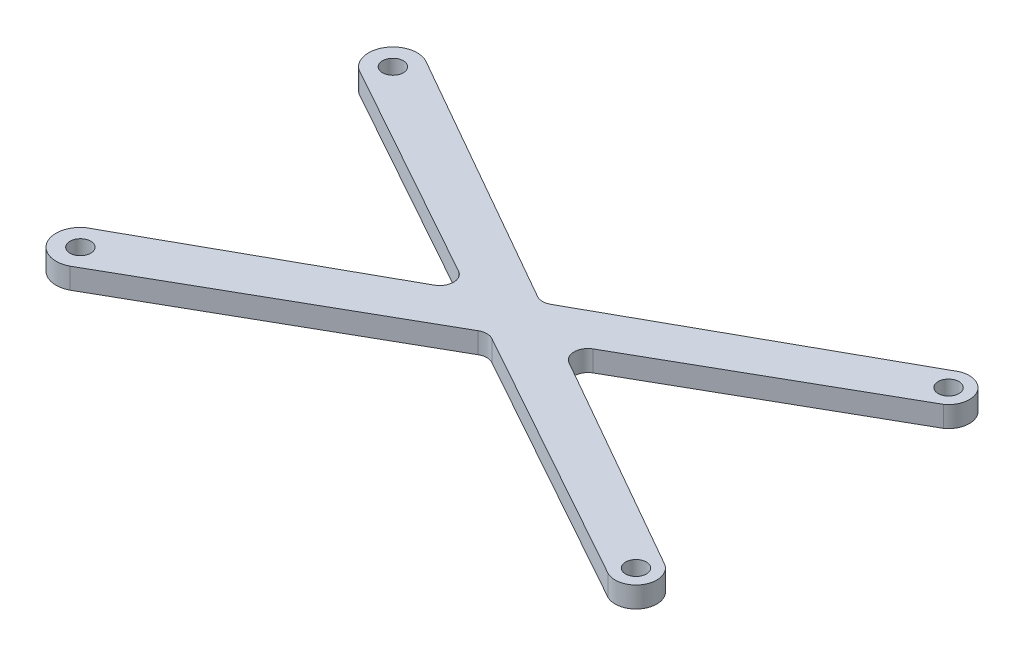
ISO-10303-21;
HEADER;
FILE_DESCRIPTION(('STEP AP214'),'2;1');
FILE_NAME('part.step','',(''),(''),'','','');
FILE_SCHEMA(('AUTOMOTIVE_DESIGN { 1 0 10303 214 1 1 1 1 }'));
ENDSEC;
DATA;
#1=APPLICATION_CONTEXT('core data for automotive mechanical design processes');
#2=APPLICATION_PROTOCOL_DEFINITION('international standard','automotive_design',2000,#1);
#3=PRODUCT_CONTEXT('',#1,'mechanical');
#4=PRODUCT('Part','Part','',(#3));
#5=PRODUCT_RELATED_PRODUCT_CATEGORY('part','',(#4));
#6=PRODUCT_DEFINITION_FORMATION('','',#4);
#7=PRODUCT_DEFINITION_CONTEXT('part definition',#1,'design');
#8=PRODUCT_DEFINITION('design','',#6,#7);
#9=PRODUCT_DEFINITION_SHAPE('','',#8);
#10=(LENGTH_UNIT() NAMED_UNIT(*) SI_UNIT(.MILLI.,.METRE.));
#11=(NAMED_UNIT(*) PLANE_ANGLE_UNIT() SI_UNIT($,.RADIAN.));
#12=(NAMED_UNIT(*) SI_UNIT($,.STERADIAN.) SOLID_ANGLE_UNIT());
#13=UNCERTAINTY_MEASURE_WITH_UNIT(LENGTH_MEASURE(1.E-05),#10,'distance_accuracy_value','');
#14=(GEOMETRIC_REPRESENTATION_CONTEXT(3) GLOBAL_UNCERTAINTY_ASSIGNED_CONTEXT((#13)) GLOBAL_UNIT_ASSIGNED_CONTEXT((#10,
#11,#12)) REPRESENTATION_CONTEXT('',''));
#15=CARTESIAN_POINT('',(0.,0.,0.));
#16=DIRECTION('',(0.,0.,1.));
#17=DIRECTION('',(1.,0.,0.));
#18=AXIS2_PLACEMENT_3D('',#15,#16,#17);
#19=CARTESIAN_POINT('',(0.,3.,-45.));
#20=DIRECTION('',(0.,1.,0.));
#21=DIRECTION('',(0.,0.,1.));
#22=AXIS2_PLACEMENT_3D('',#19,#20,#21);
#23=PLANE('',#22);
#24=CARTESIAN_POINT('',(80.,3.,0.));
#25=DIRECTION('',(0.,1.,0.));
#26=DIRECTION('',(0.,0.,1.));
#27=AXIS2_PLACEMENT_3D('',#24,#25,#26);
#28=CIRCLE('',#27,1.5);
#29=CARTESIAN_POINT('',(80.,3.,1.5));
#30=VERTEX_POINT('',#29);
#31=EDGE_CURVE('E345',#30,#30,#28,.T.);
#32=ORIENTED_EDGE('',*,*,#31,.F.);
#33=EDGE_LOOP('',(#32));
#34=FACE_BOUND('',#33,.T.);
#35=CARTESIAN_POINT('',(0.,3.,-45.));
#36=DIRECTION('',(0.,1.,0.));
#37=DIRECTION('',(0.,0.,1.));
#38=AXIS2_PLACEMENT_3D('',#35,#36,#37);
#39=CIRCLE('',#38,1.5);
#40=CARTESIAN_POINT('',(0.,3.,-43.5));
#41=VERTEX_POINT('',#40);
#42=EDGE_CURVE('E184',#41,#41,#39,.T.);
#43=ORIENTED_EDGE('',*,*,#42,.F.);
#44=EDGE_LOOP('',(#43));
#45=FACE_BOUND('',#44,.T.);
#46=CARTESIAN_POINT('',(0.,3.,-45.));
#47=DIRECTION('',(0.,1.,0.));
#48=DIRECTION('',(0.,0.,1.));
#49=AXIS2_PLACEMENT_3D('',#46,#47,#48);
#50=CIRCLE('',#49,3.5);
#51=CARTESIAN_POINT('',(1.62243917462882,3.,-48.1012402558702));
#52=VERTEX_POINT('',#51);
#53=CARTESIAN_POINT('',(-2.10604826204921,3.,-42.2045464200027));
#54=VERTEX_POINT('',#53);
#55=EDGE_CURVE('E211',#52,#54,#50,.T.);
#56=ORIENTED_EDGE('',*,*,#55,.T.);
#57=DIRECTION('',(0.874074892099252,0.,0.485791192799624));
#58=VECTOR('',#57,1.);
#59=CARTESIAN_POINT('',(-2.10604826204921,3.,-42.2045464200027));
#60=LINE('',#59,#58);
#61=CARTESIAN_POINT('',(30.2025561024721,3.,-24.2481497841985));
#62=VERTEX_POINT('',#61);
#63=EDGE_CURVE('E119',#54,#62,#60,.T.);
#64=ORIENTED_EDGE('',*,*,#63,.T.);
#65=CARTESIAN_POINT('',(29.2309737168729,3.,-22.5));
#66=DIRECTION('',(0.,-1.,0.));
#67=DIRECTION('',(0.,0.,1.));
#68=AXIS2_PLACEMENT_3D('',#65,#66,#67);
#69=CIRCLE('',#68,2.);
#70=CARTESIAN_POINT('',(30.2025561024721,3.,-20.7518502158015));
#71=VERTEX_POINT('',#70);
#72=EDGE_CURVE('E250',#62,#71,#69,.T.);
#73=ORIENTED_EDGE('',*,*,#72,.T.);
#74=DIRECTION('',(-0.874074892099252,0.,0.485791192799624));
#75=VECTOR('',#74,1.);
#76=CARTESIAN_POINT('',(-2.10604826204921,3.,-2.79545357999726));
#77=LINE('',#76,#75);
#78=CARTESIAN_POINT('',(-2.10604826204921,3.,-2.79545357999726));
#79=VERTEX_POINT('',#78);
#80=EDGE_CURVE('E269',#71,#79,#77,.T.);
#81=ORIENTED_EDGE('',*,*,#80,.T.);
#82=CARTESIAN_POINT('',(0.,3.,0.));
#83=DIRECTION('',(0.,1.,0.));
#84=DIRECTION('',(0.,0.,1.));
#85=AXIS2_PLACEMENT_3D('',#82,#83,#84);
#86=CIRCLE('',#85,3.5);
#87=CARTESIAN_POINT('',(1.62243917462884,3.,3.10124025587017));
#88=VERTEX_POINT('',#87);
#89=EDGE_CURVE('E266',#79,#88,#86,.T.);
#90=ORIENTED_EDGE('',*,*,#89,.T.);
#91=DIRECTION('',(0.868838281917041,0.,-0.495095990566925));
#92=VECTOR('',#91,1.);
#93=CARTESIAN_POINT('',(1.62243917462884,3.,3.10124025587017));
#94=LINE('',#93,#92);
#95=CARTESIAN_POINT('',(39.0533725014589,3.,-18.2282814733081));
#96=VERTEX_POINT('',#95);
#97=EDGE_CURVE('E268',#88,#96,#94,.T.);
#98=ORIENTED_EDGE('',*,*,#97,.T.);
#99=CARTESIAN_POINT('',(40.0435644825927,3.,-16.490604909474));
#100=DIRECTION('',(0.,-1.,0.));
#101=DIRECTION('',(0.,0.,-1.));
#102=AXIS2_PLACEMENT_3D('',#99,#100,#101);
#103=CIRCLE('',#102,2.);
#104=CARTESIAN_POINT('',(41.015146868192,3.,-18.2387546936725));
#105=VERTEX_POINT('',#104);
#106=EDGE_CURVE('E271',#96,#105,#103,.T.);
#107=ORIENTED_EDGE('',*,*,#106,.T.);
#108=DIRECTION('',(0.874074892099252,0.,0.485791192799624));
#109=VECTOR('',#108,1.);
#110=CARTESIAN_POINT('',(41.015146868192,3.,-18.2387546936725));
#111=LINE('',#110,#109);
#112=CARTESIAN_POINT('',(78.6716816799802,3.,2.68990156710235));
#113=VERTEX_POINT('',#112);
#114=EDGE_CURVE('E277',#105,#113,#111,.T.);
#115=ORIENTED_EDGE('',*,*,#114,.T.);
#116=CARTESIAN_POINT('',(80.,3.,0.));
#117=DIRECTION('',(0.,1.,0.));
#118=DIRECTION('',(0.,0.,1.));
#119=AXIS2_PLACEMENT_3D('',#116,#117,#118);
#120=CIRCLE('',#119,3.);
#121=CARTESIAN_POINT('',(81.7142336000182,3.,-2.46199170684399));
#122=VERTEX_POINT('',#121);
#123=EDGE_CURVE('E279',#113,#122,#120,.T.);
#124=ORIENTED_EDGE('',*,*,#123,.T.);
#125=DIRECTION('',(-0.868838281917041,0.,-0.495095990566925));
#126=VECTOR('',#125,1.);
#127=CARTESIAN_POINT('',(49.5991911008674,3.,-20.7623234361659));
#128=LINE('',#127,#126);
#129=CARTESIAN_POINT('',(49.5991911008674,3.,-20.7623234361659));
#130=VERTEX_POINT('',#129);
#131=EDGE_CURVE('E281',#122,#130,#128,.T.);
#132=ORIENTED_EDGE('',*,*,#131,.T.);
#133=CARTESIAN_POINT('',(50.5893830820013,3.,-22.5));
#134=DIRECTION('',(0.,-1.,0.));
#135=DIRECTION('',(0.,0.,-1.));
#136=AXIS2_PLACEMENT_3D('',#133,#134,#135);
#137=CIRCLE('',#136,2.);
#138=CARTESIAN_POINT('',(49.5991911008674,3.,-24.2376765638341));
#139=VERTEX_POINT('',#138);
#140=EDGE_CURVE('E283',#130,#139,#137,.T.);
#141=ORIENTED_EDGE('',*,*,#140,.T.);
#142=DIRECTION('',(0.868838281917041,0.,-0.495095990566925));
#143=VECTOR('',#142,1.);
#144=CARTESIAN_POINT('',(49.5991911008674,3.,-24.2376765638341));
#145=LINE('',#144,#143);
#146=CARTESIAN_POINT('',(81.7142336000182,3.,-42.538008293156));
#147=VERTEX_POINT('',#146);
#148=EDGE_CURVE('E285',#139,#147,#145,.T.);
#149=ORIENTED_EDGE('',*,*,#148,.T.);
#150=CARTESIAN_POINT('',(80.,3.,-45.));
#151=DIRECTION('',(0.,1.,0.));
#152=DIRECTION('',(0.,0.,1.));
#153=AXIS2_PLACEMENT_3D('',#150,#151,#152);
#154=CIRCLE('',#153,3.);
#155=CARTESIAN_POINT('',(78.6716816799801,3.,-47.6899015671023));
#156=VERTEX_POINT('',#155);
#157=EDGE_CURVE('E162',#147,#156,#154,.T.);
#158=ORIENTED_EDGE('',*,*,#157,.T.);
#159=DIRECTION('',(-0.874074892099252,0.,0.485791192799624));
#160=VECTOR('',#159,1.);
#161=CARTESIAN_POINT('',(41.015146868192,3.,-26.7612453063275));
#162=LINE('',#161,#160);
#163=CARTESIAN_POINT('',(41.015146868192,3.,-26.7612453063275));
#164=VERTEX_POINT('',#163);
#165=EDGE_CURVE('E156',#156,#164,#162,.T.);
#166=ORIENTED_EDGE('',*,*,#165,.T.);
#167=CARTESIAN_POINT('',(40.0435644825927,3.,-28.509395090526));
#168=DIRECTION('',(0.,-1.,0.));
#169=DIRECTION('',(0.,0.,-1.));
#170=AXIS2_PLACEMENT_3D('',#167,#168,#169);
#171=CIRCLE('',#170,2.);
#172=CARTESIAN_POINT('',(39.0533725014589,3.,-26.7717185266919));
#173=VERTEX_POINT('',#172);
#174=EDGE_CURVE('E160',#164,#173,#171,.T.);
#175=ORIENTED_EDGE('',*,*,#174,.T.);
#176=DIRECTION('',(-0.868838281917041,0.,-0.495095990566925));
#177=VECTOR('',#176,1.);
#178=CARTESIAN_POINT('',(1.62243917462882,3.,-48.1012402558702));
#179=LINE('',#178,#177);
#180=EDGE_CURVE('E52',#173,#52,#179,.T.);
#181=ORIENTED_EDGE('',*,*,#180,.T.);
#182=EDGE_LOOP('',(#56,#64,#73,#81,#90,#98,#107,#115,#124,#132,#141,#149,#158,#166,#175,#181));
#183=FACE_BOUND('',#182,.T.);
#184=CARTESIAN_POINT('',(80.,3.,-45.));
#185=DIRECTION('',(0.,1.,0.));
#186=DIRECTION('',(0.,0.,1.));
#187=AXIS2_PLACEMENT_3D('',#184,#185,#186);
#188=CIRCLE('',#187,1.5);
#189=CARTESIAN_POINT('',(80.,3.,-43.5));
#190=VERTEX_POINT('',#189);
#191=EDGE_CURVE('E351',#190,#190,#188,.T.);
#192=ORIENTED_EDGE('',*,*,#191,.F.);
#193=EDGE_LOOP('',(#192));
#194=FACE_BOUND('',#193,.T.);
#195=CARTESIAN_POINT('',(0.,3.,0.));
#196=DIRECTION('',(0.,1.,0.));
#197=DIRECTION('',(0.,0.,1.));
#198=AXIS2_PLACEMENT_3D('',#195,#196,#197);
#199=CIRCLE('',#198,1.5);
#200=CARTESIAN_POINT('',(0.,3.,1.5));
#201=VERTEX_POINT('',#200);
#202=EDGE_CURVE('E336',#201,#201,#199,.T.);
#203=ORIENTED_EDGE('',*,*,#202,.F.);
#204=EDGE_LOOP('',(#203));
#205=FACE_BOUND('',#204,.T.);
#206=ADVANCED_FACE('F35',(#34,#45,#183,#194,#205),#23,.T.);
#207=CARTESIAN_POINT('',(0.,0.,-45.));
#208=DIRECTION('',(0.,1.,0.));
#209=DIRECTION('',(0.,0.,1.));
#210=AXIS2_PLACEMENT_3D('',#207,#208,#209);
#211=PLANE('',#210);
#212=CARTESIAN_POINT('',(0.,0.,-45.));
#213=DIRECTION('',(0.,1.,0.));
#214=DIRECTION('',(0.,0.,1.));
#215=AXIS2_PLACEMENT_3D('',#212,#213,#214);
#216=CIRCLE('',#215,3.5);
#217=CARTESIAN_POINT('',(1.62243917462882,0.,-48.1012402558702));
#218=VERTEX_POINT('',#217);
#219=CARTESIAN_POINT('',(-2.10604826204921,0.,-42.2045464200027));
#220=VERTEX_POINT('',#219);
#221=EDGE_CURVE('E180',#218,#220,#216,.T.);
#222=ORIENTED_EDGE('',*,*,#221,.F.);
#223=DIRECTION('',(-0.868838281917041,0.,-0.495095990566925));
#224=VECTOR('',#223,1.);
#225=CARTESIAN_POINT('',(1.62243917462882,0.,-48.1012402558702));
#226=LINE('',#225,#224);
#227=CARTESIAN_POINT('',(39.0533725014589,0.,-26.7717185266919));
#228=VERTEX_POINT('',#227);
#229=EDGE_CURVE('E111',#228,#218,#226,.T.);
#230=ORIENTED_EDGE('',*,*,#229,.F.);
#231=CARTESIAN_POINT('',(40.0435644825927,0.,-28.509395090526));
#232=DIRECTION('',(0.,-1.,0.));
#233=DIRECTION('',(0.,0.,-1.));
#234=AXIS2_PLACEMENT_3D('',#231,#232,#233);
#235=CIRCLE('',#234,2.);
#236=CARTESIAN_POINT('',(41.015146868192,0.,-26.7612453063275));
#237=VERTEX_POINT('',#236);
#238=EDGE_CURVE('E105',#237,#228,#235,.T.);
#239=ORIENTED_EDGE('',*,*,#238,.F.);
#240=DIRECTION('',(-0.874074892099252,0.,0.485791192799624));
#241=VECTOR('',#240,1.);
#242=CARTESIAN_POINT('',(41.015146868192,0.,-26.7612453063275));
#243=LINE('',#242,#241);
#244=CARTESIAN_POINT('',(78.6716816799801,0.,-47.6899015671023));
#245=VERTEX_POINT('',#244);
#246=EDGE_CURVE('E170',#245,#237,#243,.T.);
#247=ORIENTED_EDGE('',*,*,#246,.F.);
#248=CARTESIAN_POINT('',(80.,0.,-45.));
#249=DIRECTION('',(0.,1.,0.));
#250=DIRECTION('',(0.,0.,1.));
#251=AXIS2_PLACEMENT_3D('',#248,#249,#250);
#252=CIRCLE('',#251,3.);
#253=CARTESIAN_POINT('',(81.7142336000182,0.,-42.538008293156));
#254=VERTEX_POINT('',#253);
#255=EDGE_CURVE('E206',#254,#245,#252,.T.);
#256=ORIENTED_EDGE('',*,*,#255,.F.);
#257=DIRECTION('',(0.868838281917041,0.,-0.495095990566925));
#258=VECTOR('',#257,1.);
#259=CARTESIAN_POINT('',(49.5991911008674,0.,-24.2376765638341));
#260=LINE('',#259,#258);
#261=CARTESIAN_POINT('',(49.5991911008674,0.,-24.2376765638341));
#262=VERTEX_POINT('',#261);
#263=EDGE_CURVE('E204',#262,#254,#260,.T.);
#264=ORIENTED_EDGE('',*,*,#263,.F.);
#265=CARTESIAN_POINT('',(50.5893830820013,0.,-22.5));
#266=DIRECTION('',(0.,-1.,0.));
#267=DIRECTION('',(0.,0.,-1.));
#268=AXIS2_PLACEMENT_3D('',#265,#266,#267);
#269=CIRCLE('',#268,2.);
#270=CARTESIAN_POINT('',(49.5991911008674,0.,-20.7623234361659));
#271=VERTEX_POINT('',#270);
#272=EDGE_CURVE('E202',#271,#262,#269,.T.);
#273=ORIENTED_EDGE('',*,*,#272,.F.);
#274=DIRECTION('',(-0.868838281917041,0.,-0.495095990566925));
#275=VECTOR('',#274,1.);
#276=CARTESIAN_POINT('',(49.5991911008674,0.,-20.7623234361659));
#277=LINE('',#276,#275);
#278=CARTESIAN_POINT('',(81.7142336000182,0.,-2.46199170684399));
#279=VERTEX_POINT('',#278);
#280=EDGE_CURVE('E200',#279,#271,#277,.T.);
#281=ORIENTED_EDGE('',*,*,#280,.F.);
#282=CARTESIAN_POINT('',(80.,0.,0.));
#283=DIRECTION('',(0.,1.,0.));
#284=DIRECTION('',(0.,0.,1.));
#285=AXIS2_PLACEMENT_3D('',#282,#283,#284);
#286=CIRCLE('',#285,3.);
#287=CARTESIAN_POINT('',(78.6716816799802,0.,2.68990156710235));
#288=VERTEX_POINT('',#287);
#289=EDGE_CURVE('E198',#288,#279,#286,.T.);
#290=ORIENTED_EDGE('',*,*,#289,.F.);
#291=DIRECTION('',(0.874074892099252,0.,0.485791192799624));
#292=VECTOR('',#291,1.);
#293=CARTESIAN_POINT('',(41.015146868192,0.,-18.2387546936725));
#294=LINE('',#293,#292);
#295=CARTESIAN_POINT('',(41.015146868192,0.,-18.2387546936725));
#296=VERTEX_POINT('',#295);
#297=EDGE_CURVE('E196',#296,#288,#294,.T.);
#298=ORIENTED_EDGE('',*,*,#297,.F.);
#299=CARTESIAN_POINT('',(40.0435644825927,0.,-16.490604909474));
#300=DIRECTION('',(0.,-1.,0.));
#301=DIRECTION('',(0.,0.,-1.));
#302=AXIS2_PLACEMENT_3D('',#299,#300,#301);
#303=CIRCLE('',#302,2.);
#304=CARTESIAN_POINT('',(39.0533725014589,0.,-18.2282814733081));
#305=VERTEX_POINT('',#304);
#306=EDGE_CURVE('E194',#305,#296,#303,.T.);
#307=ORIENTED_EDGE('',*,*,#306,.F.);
#308=DIRECTION('',(0.868838281917041,0.,-0.495095990566925));
#309=VECTOR('',#308,1.);
#310=CARTESIAN_POINT('',(1.62243917462884,0.,3.10124025587017));
#311=LINE('',#310,#309);
#312=CARTESIAN_POINT('',(1.62243917462884,0.,3.10124025587017));
#313=VERTEX_POINT('',#312);
#314=EDGE_CURVE('E192',#313,#305,#311,.T.);
#315=ORIENTED_EDGE('',*,*,#314,.F.);
#316=CARTESIAN_POINT('',(0.,0.,0.));
#317=DIRECTION('',(0.,1.,0.));
#318=DIRECTION('',(0.,0.,1.));
#319=AXIS2_PLACEMENT_3D('',#316,#317,#318);
#320=CIRCLE('',#319,3.5);
#321=CARTESIAN_POINT('',(-2.10604826204921,0.,-2.79545357999726));
#322=VERTEX_POINT('',#321);
#323=EDGE_CURVE('E190',#322,#313,#320,.T.);
#324=ORIENTED_EDGE('',*,*,#323,.F.);
#325=DIRECTION('',(-0.874074892099252,0.,0.485791192799624));
#326=VECTOR('',#325,1.);
#327=CARTESIAN_POINT('',(-2.10604826204921,0.,-2.79545357999726));
#328=LINE('',#327,#326);
#329=CARTESIAN_POINT('',(30.2025561024721,0.,-20.7518502158015));
#330=VERTEX_POINT('',#329);
#331=EDGE_CURVE('E188',#330,#322,#328,.T.);
#332=ORIENTED_EDGE('',*,*,#331,.F.);
#333=CARTESIAN_POINT('',(29.2309737168729,0.,-22.5));
#334=DIRECTION('',(0.,-1.,0.));
#335=DIRECTION('',(0.,0.,1.));
#336=AXIS2_PLACEMENT_3D('',#333,#334,#335);
#337=CIRCLE('',#336,2.);
#338=CARTESIAN_POINT('',(30.2025561024721,0.,-24.2481497841985));
#339=VERTEX_POINT('',#338);
#340=EDGE_CURVE('E186',#339,#330,#337,.T.);
#341=ORIENTED_EDGE('',*,*,#340,.F.);
#342=DIRECTION('',(0.874074892099252,0.,0.485791192799624));
#343=VECTOR('',#342,1.);
#344=CARTESIAN_POINT('',(-2.10604826204921,0.,-42.2045464200027));
#345=LINE('',#344,#343);
#346=EDGE_CURVE('E183',#220,#339,#345,.T.);
#347=ORIENTED_EDGE('',*,*,#346,.F.);
#348=EDGE_LOOP('',(#222,#230,#239,#247,#256,#264,#273,#281,#290,#298,#307,#315,#324,#332,#341,#347));
#349=FACE_BOUND('',#348,.T.);
#350=CARTESIAN_POINT('',(0.,0.,-45.));
#351=DIRECTION('',(0.,1.,0.));
#352=DIRECTION('',(0.,0.,1.));
#353=AXIS2_PLACEMENT_3D('',#350,#351,#352);
#354=CIRCLE('',#353,1.5);
#355=CARTESIAN_POINT('',(0.,0.,-43.5));
#356=VERTEX_POINT('',#355);
#357=EDGE_CURVE('E354',#356,#356,#354,.T.);
#358=ORIENTED_EDGE('',*,*,#357,.T.);
#359=EDGE_LOOP('',(#358));
#360=FACE_BOUND('',#359,.T.);
#361=CARTESIAN_POINT('',(80.,0.,-45.));
#362=DIRECTION('',(0.,1.,0.));
#363=DIRECTION('',(0.,0.,1.));
#364=AXIS2_PLACEMENT_3D('',#361,#362,#363);
#365=CIRCLE('',#364,1.5);
#366=CARTESIAN_POINT('',(80.,0.,-43.5));
#367=VERTEX_POINT('',#366);
#368=EDGE_CURVE('E348',#367,#367,#365,.T.);
#369=ORIENTED_EDGE('',*,*,#368,.T.);
#370=EDGE_LOOP('',(#369));
#371=FACE_BOUND('',#370,.T.);
#372=CARTESIAN_POINT('',(80.,0.,0.));
#373=DIRECTION('',(0.,1.,0.));
#374=DIRECTION('',(0.,0.,1.));
#375=AXIS2_PLACEMENT_3D('',#372,#373,#374);
#376=CIRCLE('',#375,1.5);
#377=CARTESIAN_POINT('',(80.,0.,1.5));
#378=VERTEX_POINT('',#377);
#379=EDGE_CURVE('E342',#378,#378,#376,.T.);
#380=ORIENTED_EDGE('',*,*,#379,.T.);
#381=EDGE_LOOP('',(#380));
#382=FACE_BOUND('',#381,.T.);
#383=CARTESIAN_POINT('',(0.,0.,0.));
#384=DIRECTION('',(0.,1.,0.));
#385=DIRECTION('',(0.,0.,1.));
#386=AXIS2_PLACEMENT_3D('',#383,#384,#385);
#387=CIRCLE('',#386,1.5);
#388=CARTESIAN_POINT('',(0.,0.,1.5));
#389=VERTEX_POINT('',#388);
#390=EDGE_CURVE('E339',#389,#389,#387,.T.);
#391=ORIENTED_EDGE('',*,*,#390,.T.);
#392=EDGE_LOOP('',(#391));
#393=FACE_BOUND('',#392,.T.);
#394=ADVANCED_FACE('F254',(#349,#360,#371,#382,#393),#211,.F.);
#395=CARTESIAN_POINT('',(0.,3.,-45.));
#396=DIRECTION('',(0.,-1.,0.));
#397=DIRECTION('',(0.,0.,-1.));
#398=AXIS2_PLACEMENT_3D('',#395,#396,#397);
#399=CYLINDRICAL_SURFACE('',#398,3.5);
#400=ORIENTED_EDGE('',*,*,#221,.T.);
#401=DIRECTION('',(0.,-1.,0.));
#402=VECTOR('',#401,1.);
#403=CARTESIAN_POINT('',(-2.10604826204921,3.,-42.2045464200027));
#404=LINE('',#403,#402);
#405=EDGE_CURVE('E11',#54,#220,#404,.T.);
#406=ORIENTED_EDGE('',*,*,#405,.F.);
#407=ORIENTED_EDGE('',*,*,#55,.F.);
#408=DIRECTION('',(0.,-1.,0.));
#409=VECTOR('',#408,1.);
#410=CARTESIAN_POINT('',(1.62243917462882,3.,-48.1012402558702));
#411=LINE('',#410,#409);
#412=EDGE_CURVE('E176',#52,#218,#411,.T.);
#413=ORIENTED_EDGE('',*,*,#412,.T.);
#414=EDGE_LOOP('',(#400,#406,#407,#413));
#415=FACE_BOUND('',#414,.T.);
#416=ADVANCED_FACE('F37',(#415),#399,.T.);
#417=CARTESIAN_POINT('',(-2.10604826204921,3.,-42.2045464200027));
#418=DIRECTION('',(0.485791192799624,0.,-0.874074892099252));
#419=DIRECTION('',(-0.874074892099252,0.,-0.485791192799624));
#420=AXIS2_PLACEMENT_3D('',#417,#418,#419);
#421=PLANE('',#420);
#422=ORIENTED_EDGE('',*,*,#346,.T.);
#423=DIRECTION('',(0.,-1.,0.));
#424=VECTOR('',#423,1.);
#425=CARTESIAN_POINT('',(30.2025561024721,3.,-24.2481497841985));
#426=LINE('',#425,#424);
#427=EDGE_CURVE('E44',#62,#339,#426,.T.);
#428=ORIENTED_EDGE('',*,*,#427,.F.);
#429=ORIENTED_EDGE('',*,*,#63,.F.);
#430=ORIENTED_EDGE('',*,*,#405,.T.);
#431=EDGE_LOOP('',(#422,#428,#429,#430));
#432=FACE_BOUND('',#431,.T.);
#433=ADVANCED_FACE('F504',(#432),#421,.F.);
#434=CARTESIAN_POINT('',(29.2309737168729,3.,-22.5));
#435=DIRECTION('',(0.,-1.,0.));
#436=DIRECTION('',(0.,0.,-1.));
#437=AXIS2_PLACEMENT_3D('',#434,#435,#436);
#438=CYLINDRICAL_SURFACE('',#437,2.);
#439=ORIENTED_EDGE('',*,*,#340,.T.);
#440=DIRECTION('',(0.,-1.,0.));
#441=VECTOR('',#440,1.);
#442=CARTESIAN_POINT('',(30.2025561024721,3.,-20.7518502158015));
#443=LINE('',#442,#441);
#444=EDGE_CURVE('E242',#71,#330,#443,.T.);
#445=ORIENTED_EDGE('',*,*,#444,.F.);
#446=ORIENTED_EDGE('',*,*,#72,.F.);
#447=ORIENTED_EDGE('',*,*,#427,.T.);
#448=EDGE_LOOP('',(#439,#445,#446,#447));
#449=FACE_BOUND('',#448,.T.);
#450=ADVANCED_FACE('F248',(#449),#438,.F.);
#451=CARTESIAN_POINT('',(-2.10604826204921,3.,-2.79545357999726));
#452=DIRECTION('',(0.485791192799624,0.,0.874074892099252));
#453=DIRECTION('',(0.874074892099252,0.,-0.485791192799624));
#454=AXIS2_PLACEMENT_3D('',#451,#452,#453);
#455=PLANE('',#454);
#456=ORIENTED_EDGE('',*,*,#331,.T.);
#457=DIRECTION('',(0.,-1.,0.));
#458=VECTOR('',#457,1.);
#459=CARTESIAN_POINT('',(-2.10604826204921,3.,-2.79545357999726));
#460=LINE('',#459,#458);
#461=EDGE_CURVE('E239',#79,#322,#460,.T.);
#462=ORIENTED_EDGE('',*,*,#461,.F.);
#463=ORIENTED_EDGE('',*,*,#80,.F.);
#464=ORIENTED_EDGE('',*,*,#444,.T.);
#465=EDGE_LOOP('',(#456,#462,#463,#464));
#466=FACE_BOUND('',#465,.T.);
#467=ADVANCED_FACE('F260',(#466),#455,.F.);
#468=CARTESIAN_POINT('',(0.,3.,0.));
#469=DIRECTION('',(0.,-1.,0.));
#470=DIRECTION('',(0.,0.,-1.));
#471=AXIS2_PLACEMENT_3D('',#468,#469,#470);
#472=CYLINDRICAL_SURFACE('',#471,3.5);
#473=ORIENTED_EDGE('',*,*,#323,.T.);
#474=DIRECTION('',(0.,-1.,0.));
#475=VECTOR('',#474,1.);
#476=CARTESIAN_POINT('',(1.62243917462884,3.,3.10124025587017));
#477=LINE('',#476,#475);
#478=EDGE_CURVE('E236',#88,#313,#477,.T.);
#479=ORIENTED_EDGE('',*,*,#478,.F.);
#480=ORIENTED_EDGE('',*,*,#89,.F.);
#481=ORIENTED_EDGE('',*,*,#461,.T.);
#482=EDGE_LOOP('',(#473,#479,#480,#481));
#483=FACE_BOUND('',#482,.T.);
#484=ADVANCED_FACE('F264',(#483),#472,.T.);
#485=CARTESIAN_POINT('',(1.62243917462884,3.,3.10124025587017));
#486=DIRECTION('',(-0.495095990566925,0.,-0.868838281917041));
#487=DIRECTION('',(-0.868838281917041,0.,0.495095990566925));
#488=AXIS2_PLACEMENT_3D('',#485,#486,#487);
#489=PLANE('',#488);
#490=ORIENTED_EDGE('',*,*,#314,.T.);
#491=DIRECTION('',(0.,-1.,0.));
#492=VECTOR('',#491,1.);
#493=CARTESIAN_POINT('',(39.0533725014589,3.,-18.2282814733081));
#494=LINE('',#493,#492);
#495=EDGE_CURVE('E233',#96,#305,#494,.T.);
#496=ORIENTED_EDGE('',*,*,#495,.F.);
#497=ORIENTED_EDGE('',*,*,#97,.F.);
#498=ORIENTED_EDGE('',*,*,#478,.T.);
#499=EDGE_LOOP('',(#490,#496,#497,#498));
#500=FACE_BOUND('',#499,.T.);
#501=ADVANCED_FACE('F469',(#500),#489,.F.);
#502=CARTESIAN_POINT('',(40.0435644825927,3.,-16.490604909474));
#503=DIRECTION('',(0.,-1.,0.));
#504=DIRECTION('',(0.,0.,-1.));
#505=AXIS2_PLACEMENT_3D('',#502,#503,#504);
#506=CYLINDRICAL_SURFACE('',#505,2.);
#507=ORIENTED_EDGE('',*,*,#306,.T.);
#508=DIRECTION('',(0.,-1.,0.));
#509=VECTOR('',#508,1.);
#510=CARTESIAN_POINT('',(41.015146868192,3.,-18.2387546936725));
#511=LINE('',#510,#509);
#512=EDGE_CURVE('E230',#105,#296,#511,.T.);
#513=ORIENTED_EDGE('',*,*,#512,.F.);
#514=ORIENTED_EDGE('',*,*,#106,.F.);
#515=ORIENTED_EDGE('',*,*,#495,.T.);
#516=EDGE_LOOP('',(#507,#513,#514,#515));
#517=FACE_BOUND('',#516,.T.);
#518=ADVANCED_FACE('F459',(#517),#506,.F.);
#519=CARTESIAN_POINT('',(41.015146868192,3.,-18.2387546936725));
#520=DIRECTION('',(0.485791192799624,0.,-0.874074892099252));
#521=DIRECTION('',(-0.874074892099252,0.,-0.485791192799624));
#522=AXIS2_PLACEMENT_3D('',#519,#520,#521);
#523=PLANE('',#522);
#524=ORIENTED_EDGE('',*,*,#297,.T.);
#525=DIRECTION('',(0.,-1.,0.));
#526=VECTOR('',#525,1.);
#527=CARTESIAN_POINT('',(78.6716816799802,3.,2.68990156710235));
#528=LINE('',#527,#526);
#529=EDGE_CURVE('E227',#113,#288,#528,.T.);
#530=ORIENTED_EDGE('',*,*,#529,.F.);
#531=ORIENTED_EDGE('',*,*,#114,.F.);
#532=ORIENTED_EDGE('',*,*,#512,.T.);
#533=EDGE_LOOP('',(#524,#530,#531,#532));
#534=FACE_BOUND('',#533,.T.);
#535=ADVANCED_FACE('F449',(#534),#523,.F.);
#536=CARTESIAN_POINT('',(80.,3.,0.));
#537=DIRECTION('',(0.,-1.,0.));
#538=DIRECTION('',(0.,0.,-1.));
#539=AXIS2_PLACEMENT_3D('',#536,#537,#538);
#540=CYLINDRICAL_SURFACE('',#539,3.);
#541=ORIENTED_EDGE('',*,*,#289,.T.);
#542=DIRECTION('',(0.,-1.,0.));
#543=VECTOR('',#542,1.);
#544=CARTESIAN_POINT('',(81.7142336000182,3.,-2.46199170684399));
#545=LINE('',#544,#543);
#546=EDGE_CURVE('E224',#122,#279,#545,.T.);
#547=ORIENTED_EDGE('',*,*,#546,.F.);
#548=ORIENTED_EDGE('',*,*,#123,.F.);
#549=ORIENTED_EDGE('',*,*,#529,.T.);
#550=EDGE_LOOP('',(#541,#547,#548,#549));
#551=FACE_BOUND('',#550,.T.);
#552=ADVANCED_FACE('F439',(#551),#540,.T.);
#553=CARTESIAN_POINT('',(49.5991911008674,3.,-20.7623234361659));
#554=DIRECTION('',(-0.495095990566925,0.,0.868838281917041));
#555=DIRECTION('',(0.868838281917041,0.,0.495095990566925));
#556=AXIS2_PLACEMENT_3D('',#553,#554,#555);
#557=PLANE('',#556);
#558=ORIENTED_EDGE('',*,*,#280,.T.);
#559=DIRECTION('',(0.,-1.,0.));
#560=VECTOR('',#559,1.);
#561=CARTESIAN_POINT('',(49.5991911008674,3.,-20.7623234361659));
#562=LINE('',#561,#560);
#563=EDGE_CURVE('E221',#130,#271,#562,.T.);
#564=ORIENTED_EDGE('',*,*,#563,.F.);
#565=ORIENTED_EDGE('',*,*,#131,.F.);
#566=ORIENTED_EDGE('',*,*,#546,.T.);
#567=EDGE_LOOP('',(#558,#564,#565,#566));
#568=FACE_BOUND('',#567,.T.);
#569=ADVANCED_FACE('F429',(#568),#557,.F.);
#570=CARTESIAN_POINT('',(50.5893830820013,3.,-22.5));
#571=DIRECTION('',(0.,-1.,0.));
#572=DIRECTION('',(0.,0.,-1.));
#573=AXIS2_PLACEMENT_3D('',#570,#571,#572);
#574=CYLINDRICAL_SURFACE('',#573,2.);
#575=ORIENTED_EDGE('',*,*,#272,.T.);
#576=DIRECTION('',(0.,-1.,0.));
#577=VECTOR('',#576,1.);
#578=CARTESIAN_POINT('',(49.5991911008674,3.,-24.2376765638341));
#579=LINE('',#578,#577);
#580=EDGE_CURVE('E218',#139,#262,#579,.T.);
#581=ORIENTED_EDGE('',*,*,#580,.F.);
#582=ORIENTED_EDGE('',*,*,#140,.F.);
#583=ORIENTED_EDGE('',*,*,#563,.T.);
#584=EDGE_LOOP('',(#575,#581,#582,#583));
#585=FACE_BOUND('',#584,.T.);
#586=ADVANCED_FACE('F420',(#585),#574,.F.);
#587=CARTESIAN_POINT('',(49.5991911008674,3.,-24.2376765638341));
#588=DIRECTION('',(-0.495095990566925,0.,-0.868838281917041));
#589=DIRECTION('',(-0.868838281917041,0.,0.495095990566925));
#590=AXIS2_PLACEMENT_3D('',#587,#588,#589);
#591=PLANE('',#590);
#592=ORIENTED_EDGE('',*,*,#263,.T.);
#593=DIRECTION('',(0.,-1.,0.));
#594=VECTOR('',#593,1.);
#595=CARTESIAN_POINT('',(81.7142336000182,3.,-42.538008293156));
#596=LINE('',#595,#594);
#597=EDGE_CURVE('E215',#147,#254,#596,.T.);
#598=ORIENTED_EDGE('',*,*,#597,.F.);
#599=ORIENTED_EDGE('',*,*,#148,.F.);
#600=ORIENTED_EDGE('',*,*,#580,.T.);
#601=EDGE_LOOP('',(#592,#598,#599,#600));
#602=FACE_BOUND('',#601,.T.);
#603=ADVANCED_FACE('F291',(#602),#591,.F.);
#604=CARTESIAN_POINT('',(80.,3.,-45.));
#605=DIRECTION('',(0.,-1.,0.));
#606=DIRECTION('',(0.,0.,-1.));
#607=AXIS2_PLACEMENT_3D('',#604,#605,#606);
#608=CYLINDRICAL_SURFACE('',#607,3.);
#609=ORIENTED_EDGE('',*,*,#255,.T.);
#610=DIRECTION('',(0.,-1.,0.));
#611=VECTOR('',#610,1.);
#612=CARTESIAN_POINT('',(78.6716816799801,3.,-47.6899015671023));
#613=LINE('',#612,#611);
#614=EDGE_CURVE('E171',#156,#245,#613,.T.);
#615=ORIENTED_EDGE('',*,*,#614,.F.);
#616=ORIENTED_EDGE('',*,*,#157,.F.);
#617=ORIENTED_EDGE('',*,*,#597,.T.);
#618=EDGE_LOOP('',(#609,#615,#616,#617));
#619=FACE_BOUND('',#618,.T.);
#620=ADVANCED_FACE('F295',(#619),#608,.T.);
#621=CARTESIAN_POINT('',(41.015146868192,3.,-26.7612453063275));
#622=DIRECTION('',(0.485791192799624,0.,0.874074892099252));
#623=DIRECTION('',(0.874074892099252,0.,-0.485791192799624));
#624=AXIS2_PLACEMENT_3D('',#621,#622,#623);
#625=PLANE('',#624);
#626=ORIENTED_EDGE('',*,*,#246,.T.);
#627=DIRECTION('',(0.,-1.,0.));
#628=VECTOR('',#627,1.);
#629=CARTESIAN_POINT('',(41.015146868192,3.,-26.7612453063275));
#630=LINE('',#629,#628);
#631=EDGE_CURVE('E167',#164,#237,#630,.T.);
#632=ORIENTED_EDGE('',*,*,#631,.F.);
#633=ORIENTED_EDGE('',*,*,#165,.F.);
#634=ORIENTED_EDGE('',*,*,#614,.T.);
#635=EDGE_LOOP('',(#626,#632,#633,#634));
#636=FACE_BOUND('',#635,.T.);
#637=ADVANCED_FACE('F168',(#636),#625,.F.);
#638=CARTESIAN_POINT('',(40.0435644825927,3.,-28.509395090526));
#639=DIRECTION('',(0.,-1.,0.));
#640=DIRECTION('',(0.,0.,-1.));
#641=AXIS2_PLACEMENT_3D('',#638,#639,#640);
#642=CYLINDRICAL_SURFACE('',#641,2.);
#643=ORIENTED_EDGE('',*,*,#238,.T.);
#644=DIRECTION('',(0.,-1.,0.));
#645=VECTOR('',#644,1.);
#646=CARTESIAN_POINT('',(39.0533725014589,3.,-26.7717185266919));
#647=LINE('',#646,#645);
#648=EDGE_CURVE('E172',#173,#228,#647,.T.);
#649=ORIENTED_EDGE('',*,*,#648,.F.);
#650=ORIENTED_EDGE('',*,*,#174,.F.);
#651=ORIENTED_EDGE('',*,*,#631,.T.);
#652=EDGE_LOOP('',(#643,#649,#650,#651));
#653=FACE_BOUND('',#652,.T.);
#654=ADVANCED_FACE('F174',(#653),#642,.F.);
#655=CARTESIAN_POINT('',(1.62243917462882,3.,-48.1012402558702));
#656=DIRECTION('',(-0.495095990566925,0.,0.868838281917041));
#657=DIRECTION('',(0.868838281917041,0.,0.495095990566925));
#658=AXIS2_PLACEMENT_3D('',#655,#656,#657);
#659=PLANE('',#658);
#660=ORIENTED_EDGE('',*,*,#229,.T.);
#661=ORIENTED_EDGE('',*,*,#412,.F.);
#662=ORIENTED_EDGE('',*,*,#180,.F.);
#663=ORIENTED_EDGE('',*,*,#648,.T.);
#664=EDGE_LOOP('',(#660,#661,#662,#663));
#665=FACE_BOUND('',#664,.T.);
#666=ADVANCED_FACE('F299',(#665),#659,.F.);
#667=CARTESIAN_POINT('',(0.,3.,-45.));
#668=DIRECTION('',(0.,-1.,0.));
#669=DIRECTION('',(0.,0.,-1.));
#670=AXIS2_PLACEMENT_3D('',#667,#668,#669);
#671=CYLINDRICAL_SURFACE('',#670,1.5);
#672=ORIENTED_EDGE('',*,*,#42,.T.);
#673=EDGE_LOOP('',(#672));
#674=FACE_BOUND('',#673,.T.);
#675=ORIENTED_EDGE('',*,*,#357,.F.);
#676=EDGE_LOOP('',(#675));
#677=FACE_BOUND('',#676,.T.);
#678=ADVANCED_FACE('F301',(#674,#677),#671,.F.);
#679=CARTESIAN_POINT('',(80.,3.,-45.));
#680=DIRECTION('',(0.,-1.,0.));
#681=DIRECTION('',(0.,0.,-1.));
#682=AXIS2_PLACEMENT_3D('',#679,#680,#681);
#683=CYLINDRICAL_SURFACE('',#682,1.5);
#684=ORIENTED_EDGE('',*,*,#191,.T.);
#685=EDGE_LOOP('',(#684));
#686=FACE_BOUND('',#685,.T.);
#687=ORIENTED_EDGE('',*,*,#368,.F.);
#688=EDGE_LOOP('',(#687));
#689=FACE_BOUND('',#688,.T.);
#690=ADVANCED_FACE('F307',(#686,#689),#683,.F.);
#691=CARTESIAN_POINT('',(80.,3.,0.));
#692=DIRECTION('',(0.,-1.,0.));
#693=DIRECTION('',(0.,0.,-1.));
#694=AXIS2_PLACEMENT_3D('',#691,#692,#693);
#695=CYLINDRICAL_SURFACE('',#694,1.5);
#696=ORIENTED_EDGE('',*,*,#31,.T.);
#697=EDGE_LOOP('',(#696));
#698=FACE_BOUND('',#697,.T.);
#699=ORIENTED_EDGE('',*,*,#379,.F.);
#700=EDGE_LOOP('',(#699));
#701=FACE_BOUND('',#700,.T.);
#702=ADVANCED_FACE('F323',(#698,#701),#695,.F.);
#703=CARTESIAN_POINT('',(0.,3.,0.));
#704=DIRECTION('',(0.,-1.,0.));
#705=DIRECTION('',(0.,0.,-1.));
#706=AXIS2_PLACEMENT_3D('',#703,#704,#705);
#707=CYLINDRICAL_SURFACE('',#706,1.5);
#708=ORIENTED_EDGE('',*,*,#202,.T.);
#709=EDGE_LOOP('',(#708));
#710=FACE_BOUND('',#709,.T.);
#711=ORIENTED_EDGE('',*,*,#390,.F.);
#712=EDGE_LOOP('',(#711));
#713=FACE_BOUND('',#712,.T.);
#714=ADVANCED_FACE('F327',(#710,#713),#707,.F.);
#715=CLOSED_SHELL('',(#206,#394,#416,#433,#450,#467,#484,#501,#518,#535,#552,#569,#586,#603,
#620,#637,#654,#666,#678,#690,#702,#714));
#716=MANIFOLD_SOLID_BREP('B2',#715);
#717=ADVANCED_BREP_SHAPE_REPRESENTATION('',(#18,#716),#14);
#718=SHAPE_DEFINITION_REPRESENTATION(#9,#717);
ENDSEC;
END-ISO-10303-21;
